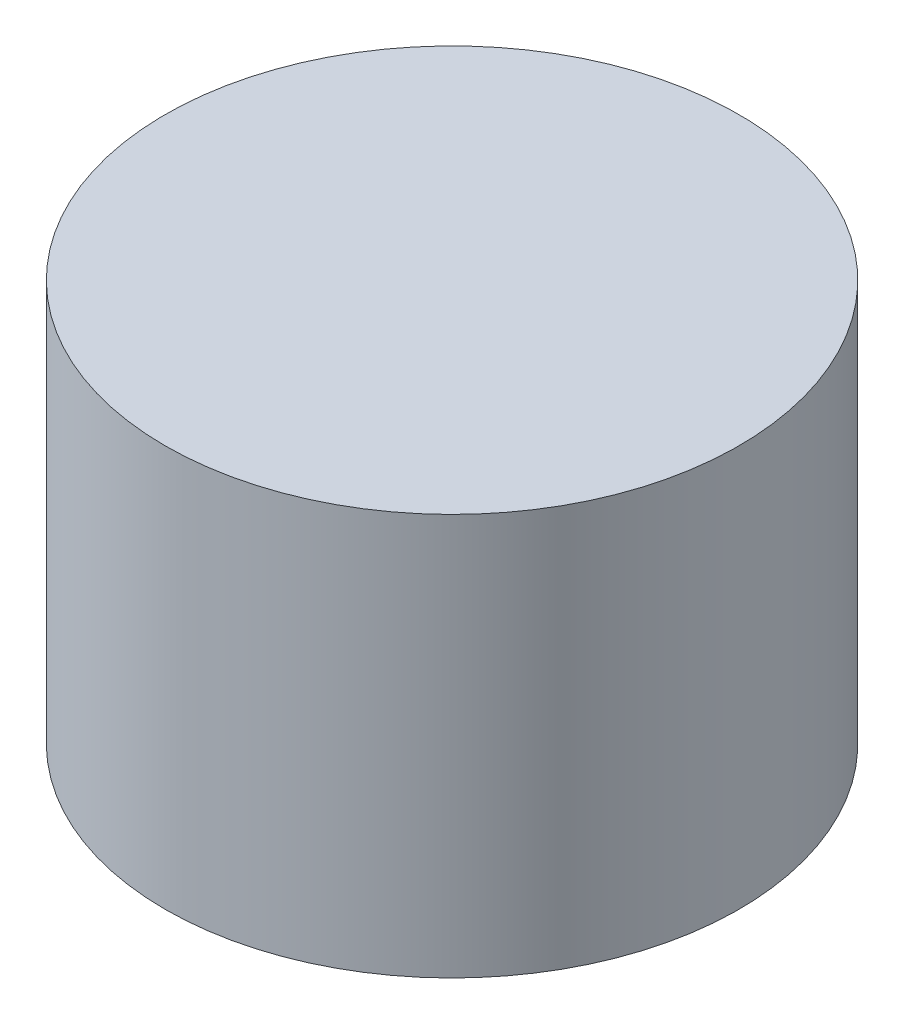
ISO-10303-21;
HEADER;
FILE_DESCRIPTION(('STEP AP214'),'2;1');
FILE_NAME('part.step','',(''),(''),'','','');
FILE_SCHEMA(('AUTOMOTIVE_DESIGN { 1 0 10303 214 1 1 1 1 }'));
ENDSEC;
DATA;
#1=APPLICATION_CONTEXT('core data for automotive mechanical design processes');
#2=APPLICATION_PROTOCOL_DEFINITION('international standard','automotive_design',2000,#1);
#3=PRODUCT_CONTEXT('',#1,'mechanical');
#4=PRODUCT('Part','Part','',(#3));
#5=PRODUCT_RELATED_PRODUCT_CATEGORY('part','',(#4));
#6=PRODUCT_DEFINITION_FORMATION('','',#4);
#7=PRODUCT_DEFINITION_CONTEXT('part definition',#1,'design');
#8=PRODUCT_DEFINITION('design','',#6,#7);
#9=PRODUCT_DEFINITION_SHAPE('','',#8);
#10=(LENGTH_UNIT() NAMED_UNIT(*) SI_UNIT(.MILLI.,.METRE.));
#11=(NAMED_UNIT(*) PLANE_ANGLE_UNIT() SI_UNIT($,.RADIAN.));
#12=(NAMED_UNIT(*) SI_UNIT($,.STERADIAN.) SOLID_ANGLE_UNIT());
#13=UNCERTAINTY_MEASURE_WITH_UNIT(LENGTH_MEASURE(1.E-05),#10,'distance_accuracy_value','');
#14=(GEOMETRIC_REPRESENTATION_CONTEXT(3) GLOBAL_UNCERTAINTY_ASSIGNED_CONTEXT((#13)) GLOBAL_UNIT_ASSIGNED_CONTEXT((#10,
#11,#12)) REPRESENTATION_CONTEXT('',''));
#15=CARTESIAN_POINT('',(0.,0.,0.));
#16=DIRECTION('',(0.,0.,1.));
#17=DIRECTION('',(1.,0.,0.));
#18=AXIS2_PLACEMENT_3D('',#15,#16,#17);
#19=CARTESIAN_POINT('',(0.,38.9,0.));
#20=DIRECTION('',(0.,-1.,0.));
#21=DIRECTION('',(0.,0.,-1.));
#22=AXIS2_PLACEMENT_3D('',#19,#20,#21);
#23=CYLINDRICAL_SURFACE('',#22,27.8);
#24=CARTESIAN_POINT('',(0.,38.9,0.));
#25=DIRECTION('',(0.,1.,0.));
#26=DIRECTION('',(0.,0.,1.));
#27=AXIS2_PLACEMENT_3D('',#24,#25,#26);
#28=CIRCLE('',#27,27.8);
#29=CARTESIAN_POINT('',(0.,38.9,27.8));
#30=VERTEX_POINT('',#29);
#31=EDGE_CURVE('E10',#30,#30,#28,.T.);
#32=ORIENTED_EDGE('',*,*,#31,.F.);
#33=EDGE_LOOP('',(#32));
#34=FACE_BOUND('',#33,.T.);
#35=CARTESIAN_POINT('',(0.,0.,0.));
#36=DIRECTION('',(0.,1.,0.));
#37=DIRECTION('',(0.,0.,1.));
#38=AXIS2_PLACEMENT_3D('',#35,#36,#37);
#39=CIRCLE('',#38,27.8);
#40=CARTESIAN_POINT('',(0.,0.,27.8));
#41=VERTEX_POINT('',#40);
#42=EDGE_CURVE('E37',#41,#41,#39,.T.);
#43=ORIENTED_EDGE('',*,*,#42,.T.);
#44=EDGE_LOOP('',(#43));
#45=FACE_BOUND('',#44,.T.);
#46=ADVANCED_FACE('F34',(#34,#45),#23,.T.);
#47=CARTESIAN_POINT('',(0.,38.9,0.));
#48=DIRECTION('',(0.,1.,0.));
#49=DIRECTION('',(0.,0.,1.));
#50=AXIS2_PLACEMENT_3D('',#47,#48,#49);
#51=PLANE('',#50);
#52=ORIENTED_EDGE('',*,*,#31,.T.);
#53=EDGE_LOOP('',(#52));
#54=FACE_BOUND('',#53,.T.);
#55=ADVANCED_FACE('F49',(#54),#51,.T.);
#56=CARTESIAN_POINT('',(0.,0.,0.));
#57=DIRECTION('',(0.,1.,0.));
#58=DIRECTION('',(0.,0.,1.));
#59=AXIS2_PLACEMENT_3D('',#56,#57,#58);
#60=PLANE('',#59);
#61=ORIENTED_EDGE('',*,*,#42,.F.);
#62=EDGE_LOOP('',(#61));
#63=FACE_BOUND('',#62,.T.);
#64=ADVANCED_FACE('F47',(#63),#60,.F.);
#65=CLOSED_SHELL('',(#46,#55,#64));
#66=MANIFOLD_SOLID_BREP('B2',#65);
#67=ADVANCED_BREP_SHAPE_REPRESENTATION('',(#18,#66),#14);
#68=SHAPE_DEFINITION_REPRESENTATION(#9,#67);
ENDSEC;
END-ISO-10303-21;
